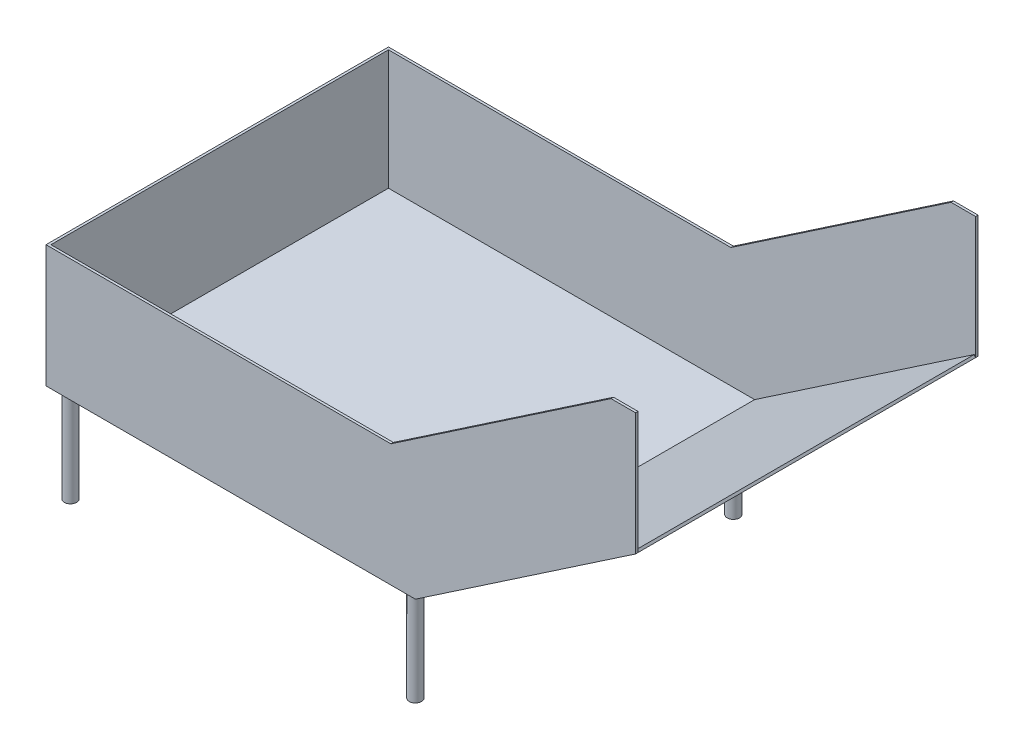
ISO-10303-21;
HEADER;
FILE_DESCRIPTION(('STEP AP214'),'2;1');
FILE_NAME('part.step','',(''),(''),'','','');
FILE_SCHEMA(('AUTOMOTIVE_DESIGN { 1 0 10303 214 1 1 1 1 }'));
ENDSEC;
DATA;
#1=APPLICATION_CONTEXT('core data for automotive mechanical design processes');
#2=APPLICATION_PROTOCOL_DEFINITION('international standard','automotive_design',2000,#1);
#3=PRODUCT_CONTEXT('',#1,'mechanical');
#4=PRODUCT('Part','Part','',(#3));
#5=PRODUCT_RELATED_PRODUCT_CATEGORY('part','',(#4));
#6=PRODUCT_DEFINITION_FORMATION('','',#4);
#7=PRODUCT_DEFINITION_CONTEXT('part definition',#1,'design');
#8=PRODUCT_DEFINITION('design','',#6,#7);
#9=PRODUCT_DEFINITION_SHAPE('','',#8);
#10=(LENGTH_UNIT() NAMED_UNIT(*) SI_UNIT(.MILLI.,.METRE.));
#11=(NAMED_UNIT(*) PLANE_ANGLE_UNIT() SI_UNIT($,.RADIAN.));
#12=(NAMED_UNIT(*) SI_UNIT($,.STERADIAN.) SOLID_ANGLE_UNIT());
#13=UNCERTAINTY_MEASURE_WITH_UNIT(LENGTH_MEASURE(1.E-05),#10,'distance_accuracy_value','');
#14=(GEOMETRIC_REPRESENTATION_CONTEXT(3) GLOBAL_UNCERTAINTY_ASSIGNED_CONTEXT((#13)) GLOBAL_UNIT_ASSIGNED_CONTEXT((#10,
#11,#12)) REPRESENTATION_CONTEXT('',''));
#15=CARTESIAN_POINT('',(0.,0.,0.));
#16=DIRECTION('',(0.,0.,1.));
#17=DIRECTION('',(1.,0.,0.));
#18=AXIS2_PLACEMENT_3D('',#15,#16,#17);
#19=CARTESIAN_POINT('',(0.,1.,0.));
#20=DIRECTION('',(0.,-1.,0.));
#21=DIRECTION('',(1.,0.,0.));
#22=AXIS2_PLACEMENT_3D('',#19,#20,#21);
#23=PLANE('',#22);
#24=DIRECTION('',(0.,0.,1.));
#25=VECTOR('',#24,1.);
#26=CARTESIAN_POINT('',(149.693042257714,1.,0.));
#27=LINE('',#26,#25);
#28=CARTESIAN_POINT('',(149.693042257714,1.,-138.));
#29=VERTEX_POINT('',#28);
#30=CARTESIAN_POINT('',(149.693042257714,1.,0.));
#31=VERTEX_POINT('',#30);
#32=EDGE_CURVE('E150',#29,#31,#27,.T.);
#33=ORIENTED_EDGE('',*,*,#32,.F.);
#34=DIRECTION('',(1.,0.,0.));
#35=VECTOR('',#34,1.);
#36=CARTESIAN_POINT('',(0.,1.,-138.));
#37=LINE('',#36,#35);
#38=CARTESIAN_POINT('',(0.,1.,-138.));
#39=VERTEX_POINT('',#38);
#40=EDGE_CURVE('E164',#39,#29,#37,.T.);
#41=ORIENTED_EDGE('',*,*,#40,.F.);
#42=DIRECTION('',(0.,0.,1.));
#43=VECTOR('',#42,1.);
#44=CARTESIAN_POINT('',(0.,1.,0.));
#45=LINE('',#44,#43);
#46=CARTESIAN_POINT('',(0.,1.,0.));
#47=VERTEX_POINT('',#46);
#48=EDGE_CURVE('E151',#39,#47,#45,.T.);
#49=ORIENTED_EDGE('',*,*,#48,.T.);
#50=DIRECTION('',(-1.,0.,0.));
#51=VECTOR('',#50,1.);
#52=CARTESIAN_POINT('',(0.,1.,0.));
#53=LINE('',#52,#51);
#54=EDGE_CURVE('E147',#31,#47,#53,.T.);
#55=ORIENTED_EDGE('',*,*,#54,.F.);
#56=EDGE_LOOP('',(#33,#41,#49,#55));
#57=FACE_BOUND('',#56,.T.);
#58=ADVANCED_FACE('F38',(#57),#23,.F.);
#59=CARTESIAN_POINT('',(0.,0.,0.));
#60=DIRECTION('',(-1.,0.,0.));
#61=DIRECTION('',(0.,0.,1.));
#62=AXIS2_PLACEMENT_3D('',#59,#60,#61);
#63=PLANE('',#62);
#64=ORIENTED_EDGE('',*,*,#48,.F.);
#65=DIRECTION('',(0.,-1.,0.));
#66=VECTOR('',#65,1.);
#67=CARTESIAN_POINT('',(0.,0.,-138.));
#68=LINE('',#67,#66);
#69=CARTESIAN_POINT('',(0.,50.,-138.));
#70=VERTEX_POINT('',#69);
#71=EDGE_CURVE('E154',#70,#39,#68,.T.);
#72=ORIENTED_EDGE('',*,*,#71,.F.);
#73=DIRECTION('',(0.,0.,-1.));
#74=VECTOR('',#73,1.);
#75=CARTESIAN_POINT('',(0.,50.,1.));
#76=LINE('',#75,#74);
#77=CARTESIAN_POINT('',(0.,50.,0.));
#78=VERTEX_POINT('',#77);
#79=EDGE_CURVE('E238',#78,#70,#76,.T.);
#80=ORIENTED_EDGE('',*,*,#79,.F.);
#81=DIRECTION('',(0.,-1.,0.));
#82=VECTOR('',#81,1.);
#83=CARTESIAN_POINT('',(0.,0.,0.));
#84=LINE('',#83,#82);
#85=EDGE_CURVE('E254',#78,#47,#84,.T.);
#86=ORIENTED_EDGE('',*,*,#85,.T.);
#87=EDGE_LOOP('',(#64,#72,#80,#86));
#88=FACE_BOUND('',#87,.T.);
#89=ADVANCED_FACE('F184',(#88),#63,.F.);
#90=CARTESIAN_POINT('',(150.,0.,1.));
#91=DIRECTION('',(0.,1.,0.));
#92=DIRECTION('',(-1.,0.,0.));
#93=AXIS2_PLACEMENT_3D('',#90,#91,#92);
#94=PLANE('',#93);
#95=CARTESIAN_POINT('',(145.,0.,-134.));
#96=DIRECTION('',(0.,1.,0.));
#97=DIRECTION('',(-1.,0.,0.));
#98=AXIS2_PLACEMENT_3D('',#95,#96,#97);
#99=CIRCLE('',#98,2.5);
#100=CARTESIAN_POINT('',(142.5,0.,-134.));
#101=VERTEX_POINT('',#100);
#102=EDGE_CURVE('E11',#101,#101,#99,.F.);
#103=ORIENTED_EDGE('',*,*,#102,.F.);
#104=EDGE_LOOP('',(#103));
#105=FACE_BOUND('',#104,.T.);
#106=CARTESIAN_POINT('',(145.,0.,-4.));
#107=DIRECTION('',(0.,1.,0.));
#108=DIRECTION('',(-1.,0.,0.));
#109=AXIS2_PLACEMENT_3D('',#106,#107,#108);
#110=CIRCLE('',#109,2.5);
#111=CARTESIAN_POINT('',(142.5,0.,-4.));
#112=VERTEX_POINT('',#111);
#113=EDGE_CURVE('E46',#112,#112,#110,.F.);
#114=ORIENTED_EDGE('',*,*,#113,.F.);
#115=EDGE_LOOP('',(#114));
#116=FACE_BOUND('',#115,.T.);
#117=CARTESIAN_POINT('',(4.,0.,-134.));
#118=DIRECTION('',(0.,1.,0.));
#119=DIRECTION('',(-1.,0.,0.));
#120=AXIS2_PLACEMENT_3D('',#117,#118,#119);
#121=CIRCLE('',#120,2.5);
#122=CARTESIAN_POINT('',(1.5,0.,-134.));
#123=VERTEX_POINT('',#122);
#124=EDGE_CURVE('E174',#123,#123,#121,.F.);
#125=ORIENTED_EDGE('',*,*,#124,.F.);
#126=EDGE_LOOP('',(#125));
#127=FACE_BOUND('',#126,.T.);
#128=CARTESIAN_POINT('',(4.,0.,-4.));
#129=DIRECTION('',(0.,1.,0.));
#130=DIRECTION('',(-1.,0.,0.));
#131=AXIS2_PLACEMENT_3D('',#128,#129,#130);
#132=CIRCLE('',#131,2.5);
#133=CARTESIAN_POINT('',(1.5,0.,-4.));
#134=VERTEX_POINT('',#133);
#135=EDGE_CURVE('E166',#134,#134,#132,.F.);
#136=ORIENTED_EDGE('',*,*,#135,.F.);
#137=EDGE_LOOP('',(#136));
#138=FACE_BOUND('',#137,.T.);
#139=DIRECTION('',(1.,0.,0.));
#140=VECTOR('',#139,1.);
#141=CARTESIAN_POINT('',(-1.,0.,-139.));
#142=LINE('',#141,#140);
#143=CARTESIAN_POINT('',(-1.,0.,-139.));
#144=VERTEX_POINT('',#143);
#145=CARTESIAN_POINT('',(150.,0.,-139.));
#146=VERTEX_POINT('',#145);
#147=EDGE_CURVE('E194',#144,#146,#142,.T.);
#148=ORIENTED_EDGE('',*,*,#147,.T.);
#149=DIRECTION('',(0.,0.,-1.));
#150=VECTOR('',#149,1.);
#151=CARTESIAN_POINT('',(150.,0.,1.));
#152=LINE('',#151,#150);
#153=CARTESIAN_POINT('',(150.,0.,1.));
#154=VERTEX_POINT('',#153);
#155=EDGE_CURVE('E168',#154,#146,#152,.T.);
#156=ORIENTED_EDGE('',*,*,#155,.F.);
#157=DIRECTION('',(1.,0.,0.));
#158=VECTOR('',#157,1.);
#159=CARTESIAN_POINT('',(150.,0.,1.));
#160=LINE('',#159,#158);
#161=CARTESIAN_POINT('',(-1.,0.,1.));
#162=VERTEX_POINT('',#161);
#163=EDGE_CURVE('E250',#162,#154,#160,.T.);
#164=ORIENTED_EDGE('',*,*,#163,.F.);
#165=DIRECTION('',(0.,0.,1.));
#166=VECTOR('',#165,1.);
#167=CARTESIAN_POINT('',(-1.,0.,1.));
#168=LINE('',#167,#166);
#169=EDGE_CURVE('E197',#144,#162,#168,.T.);
#170=ORIENTED_EDGE('',*,*,#169,.F.);
#171=EDGE_LOOP('',(#148,#156,#164,#170));
#172=FACE_BOUND('',#171,.T.);
#173=ADVANCED_FACE('F40',(#105,#116,#127,#138,#172),#94,.F.);
#174=CARTESIAN_POINT('',(240.,61.,1.));
#175=DIRECTION('',(-0.561051498100533,0.827780898836852,0.));
#176=DIRECTION('',(-0.827780898836852,-0.561051498100533,0.));
#177=AXIS2_PLACEMENT_3D('',#174,#175,#176);
#178=PLANE('',#177);
#179=ORIENTED_EDGE('',*,*,#155,.T.);
#180=DIRECTION('',(0.827780898836852,0.561051498100533,0.));
#181=VECTOR('',#180,1.);
#182=CARTESIAN_POINT('',(240.,61.,-139.));
#183=LINE('',#182,#181);
#184=CARTESIAN_POINT('',(240.,61.,-139.));
#185=VERTEX_POINT('',#184);
#186=EDGE_CURVE('E204',#146,#185,#183,.T.);
#187=ORIENTED_EDGE('',*,*,#186,.T.);
#188=DIRECTION('',(0.,0.,1.));
#189=VECTOR('',#188,1.);
#190=CARTESIAN_POINT('',(240.,61.,-139.));
#191=LINE('',#190,#189);
#192=CARTESIAN_POINT('',(240.,61.,-138.));
#193=VERTEX_POINT('',#192);
#194=EDGE_CURVE('E211',#185,#193,#191,.T.);
#195=ORIENTED_EDGE('',*,*,#194,.T.);
#196=DIRECTION('',(0.,0.,1.));
#197=VECTOR('',#196,1.);
#198=CARTESIAN_POINT('',(240.,61.,-139.));
#199=LINE('',#198,#197);
#200=CARTESIAN_POINT('',(240.,61.,0.));
#201=VERTEX_POINT('',#200);
#202=EDGE_CURVE('E309',#193,#201,#199,.T.);
#203=ORIENTED_EDGE('',*,*,#202,.T.);
#204=DIRECTION('',(0.,0.,-1.));
#205=VECTOR('',#204,1.);
#206=CARTESIAN_POINT('',(240.,61.,1.));
#207=LINE('',#206,#205);
#208=CARTESIAN_POINT('',(240.,61.,1.));
#209=VERTEX_POINT('',#208);
#210=EDGE_CURVE('E282',#209,#201,#207,.T.);
#211=ORIENTED_EDGE('',*,*,#210,.F.);
#212=DIRECTION('',(0.827780898836852,0.561051498100533,0.));
#213=VECTOR('',#212,1.);
#214=CARTESIAN_POINT('',(240.,61.,1.));
#215=LINE('',#214,#213);
#216=EDGE_CURVE('E253',#154,#209,#215,.T.);
#217=ORIENTED_EDGE('',*,*,#216,.F.);
#218=EDGE_LOOP('',(#179,#187,#195,#203,#211,#217));
#219=FACE_BOUND('',#218,.T.);
#220=ADVANCED_FACE('F183',(#219),#178,.F.);
#221=CARTESIAN_POINT('',(240.,111.,1.));
#222=DIRECTION('',(-1.,0.,0.));
#223=DIRECTION('',(0.,-1.,0.));
#224=AXIS2_PLACEMENT_3D('',#221,#222,#223);
#225=PLANE('',#224);
#226=DIRECTION('',(0.,1.,0.));
#227=VECTOR('',#226,1.);
#228=CARTESIAN_POINT('',(240.,111.,0.));
#229=LINE('',#228,#227);
#230=CARTESIAN_POINT('',(240.,111.,0.));
#231=VERTEX_POINT('',#230);
#232=EDGE_CURVE('E249',#201,#231,#229,.T.);
#233=ORIENTED_EDGE('',*,*,#232,.T.);
#234=DIRECTION('',(0.,0.,-1.));
#235=VECTOR('',#234,1.);
#236=CARTESIAN_POINT('',(240.,111.,1.));
#237=LINE('',#236,#235);
#238=CARTESIAN_POINT('',(240.,111.,1.));
#239=VERTEX_POINT('',#238);
#240=EDGE_CURVE('E279',#239,#231,#237,.T.);
#241=ORIENTED_EDGE('',*,*,#240,.F.);
#242=DIRECTION('',(0.,1.,0.));
#243=VECTOR('',#242,1.);
#244=CARTESIAN_POINT('',(240.,111.,1.));
#245=LINE('',#244,#243);
#246=EDGE_CURVE('E256',#209,#239,#245,.T.);
#247=ORIENTED_EDGE('',*,*,#246,.F.);
#248=ORIENTED_EDGE('',*,*,#210,.T.);
#249=EDGE_LOOP('',(#233,#241,#247,#248));
#250=FACE_BOUND('',#249,.T.);
#251=ADVANCED_FACE('F381',(#250),#225,.F.);
#252=CARTESIAN_POINT('',(230.,111.,1.));
#253=DIRECTION('',(0.,-1.,0.));
#254=DIRECTION('',(0.,0.,-1.));
#255=AXIS2_PLACEMENT_3D('',#252,#253,#254);
#256=PLANE('',#255);
#257=DIRECTION('',(-1.,0.,0.));
#258=VECTOR('',#257,1.);
#259=CARTESIAN_POINT('',(230.,111.,0.));
#260=LINE('',#259,#258);
#261=CARTESIAN_POINT('',(230.,111.,0.));
#262=VERTEX_POINT('',#261);
#263=EDGE_CURVE('E267',#231,#262,#260,.T.);
#264=ORIENTED_EDGE('',*,*,#263,.T.);
#265=DIRECTION('',(0.,0.,-1.));
#266=VECTOR('',#265,1.);
#267=CARTESIAN_POINT('',(230.,111.,1.));
#268=LINE('',#267,#266);
#269=CARTESIAN_POINT('',(230.,111.,1.));
#270=VERTEX_POINT('',#269);
#271=EDGE_CURVE('E276',#270,#262,#268,.T.);
#272=ORIENTED_EDGE('',*,*,#271,.F.);
#273=DIRECTION('',(-1.,0.,0.));
#274=VECTOR('',#273,1.);
#275=CARTESIAN_POINT('',(230.,111.,1.));
#276=LINE('',#275,#274);
#277=EDGE_CURVE('E258',#239,#270,#276,.T.);
#278=ORIENTED_EDGE('',*,*,#277,.F.);
#279=ORIENTED_EDGE('',*,*,#240,.T.);
#280=EDGE_LOOP('',(#264,#272,#278,#279));
#281=FACE_BOUND('',#280,.T.);
#282=ADVANCED_FACE('F377',(#281),#256,.F.);
#283=CARTESIAN_POINT('',(140.,50.,1.));
#284=DIRECTION('',(0.561051498100534,-0.827780898836852,0.));
#285=DIRECTION('',(0.827780898836852,0.561051498100534,0.));
#286=AXIS2_PLACEMENT_3D('',#283,#284,#285);
#287=PLANE('',#286);
#288=DIRECTION('',(-0.827780898836852,-0.561051498100534,0.));
#289=VECTOR('',#288,1.);
#290=CARTESIAN_POINT('',(140.,50.,0.));
#291=LINE('',#290,#289);
#292=CARTESIAN_POINT('',(140.,50.,0.));
#293=VERTEX_POINT('',#292);
#294=EDGE_CURVE('E269',#262,#293,#291,.T.);
#295=ORIENTED_EDGE('',*,*,#294,.T.);
#296=DIRECTION('',(0.,0.,-1.));
#297=VECTOR('',#296,1.);
#298=CARTESIAN_POINT('',(140.,50.,1.));
#299=LINE('',#298,#297);
#300=CARTESIAN_POINT('',(140.,50.,1.));
#301=VERTEX_POINT('',#300);
#302=EDGE_CURVE('E265',#301,#293,#299,.T.);
#303=ORIENTED_EDGE('',*,*,#302,.F.);
#304=DIRECTION('',(-0.827780898836852,-0.561051498100534,0.));
#305=VECTOR('',#304,1.);
#306=CARTESIAN_POINT('',(140.,50.,1.));
#307=LINE('',#306,#305);
#308=EDGE_CURVE('E260',#270,#301,#307,.T.);
#309=ORIENTED_EDGE('',*,*,#308,.F.);
#310=ORIENTED_EDGE('',*,*,#271,.T.);
#311=EDGE_LOOP('',(#295,#303,#309,#310));
#312=FACE_BOUND('',#311,.T.);
#313=ADVANCED_FACE('F374',(#312),#287,.F.);
#314=CARTESIAN_POINT('',(0.,50.,1.));
#315=DIRECTION('',(0.,-1.,0.));
#316=DIRECTION('',(0.,0.,-1.));
#317=AXIS2_PLACEMENT_3D('',#314,#315,#316);
#318=PLANE('',#317);
#319=DIRECTION('',(-1.,0.,0.));
#320=VECTOR('',#319,1.);
#321=CARTESIAN_POINT('',(0.,50.,0.));
#322=LINE('',#321,#320);
#323=EDGE_CURVE('E271',#293,#78,#322,.T.);
#324=ORIENTED_EDGE('',*,*,#323,.T.);
#325=ORIENTED_EDGE('',*,*,#79,.T.);
#326=DIRECTION('',(-1.,0.,0.));
#327=VECTOR('',#326,1.);
#328=CARTESIAN_POINT('',(0.,50.,-138.));
#329=LINE('',#328,#327);
#330=CARTESIAN_POINT('',(140.,50.,-138.));
#331=VERTEX_POINT('',#330);
#332=EDGE_CURVE('E221',#331,#70,#329,.T.);
#333=ORIENTED_EDGE('',*,*,#332,.F.);
#334=DIRECTION('',(0.,0.,1.));
#335=VECTOR('',#334,1.);
#336=CARTESIAN_POINT('',(140.,50.,-139.));
#337=LINE('',#336,#335);
#338=CARTESIAN_POINT('',(140.,50.,-139.));
#339=VERTEX_POINT('',#338);
#340=EDGE_CURVE('E236',#339,#331,#337,.T.);
#341=ORIENTED_EDGE('',*,*,#340,.F.);
#342=DIRECTION('',(1.,0.,0.));
#343=VECTOR('',#342,1.);
#344=CARTESIAN_POINT('',(-1.,50.,-139.));
#345=LINE('',#344,#343);
#346=CARTESIAN_POINT('',(-1.,50.,-139.));
#347=VERTEX_POINT('',#346);
#348=EDGE_CURVE('E200',#347,#339,#345,.T.);
#349=ORIENTED_EDGE('',*,*,#348,.F.);
#350=DIRECTION('',(0.,0.,-1.));
#351=VECTOR('',#350,1.);
#352=CARTESIAN_POINT('',(-1.,50.,1.));
#353=LINE('',#352,#351);
#354=CARTESIAN_POINT('',(-1.,50.,1.));
#355=VERTEX_POINT('',#354);
#356=EDGE_CURVE('E241',#355,#347,#353,.T.);
#357=ORIENTED_EDGE('',*,*,#356,.F.);
#358=DIRECTION('',(-1.,0.,0.));
#359=VECTOR('',#358,1.);
#360=CARTESIAN_POINT('',(0.,50.,1.));
#361=LINE('',#360,#359);
#362=EDGE_CURVE('E262',#301,#355,#361,.T.);
#363=ORIENTED_EDGE('',*,*,#362,.F.);
#364=ORIENTED_EDGE('',*,*,#302,.T.);
#365=EDGE_LOOP('',(#324,#325,#333,#341,#349,#357,#363,#364));
#366=FACE_BOUND('',#365,.T.);
#367=ADVANCED_FACE('F299',(#366),#318,.F.);
#368=CARTESIAN_POINT('',(0.,0.,1.));
#369=DIRECTION('',(0.,0.,-1.));
#370=DIRECTION('',(-1.,0.,0.));
#371=AXIS2_PLACEMENT_3D('',#368,#369,#370);
#372=PLANE('',#371);
#373=ORIENTED_EDGE('',*,*,#216,.T.);
#374=ORIENTED_EDGE('',*,*,#246,.T.);
#375=ORIENTED_EDGE('',*,*,#277,.T.);
#376=ORIENTED_EDGE('',*,*,#308,.T.);
#377=ORIENTED_EDGE('',*,*,#362,.T.);
#378=DIRECTION('',(0.,1.,0.));
#379=VECTOR('',#378,1.);
#380=CARTESIAN_POINT('',(-1.,0.,1.));
#381=LINE('',#380,#379);
#382=EDGE_CURVE('E239',#162,#355,#381,.T.);
#383=ORIENTED_EDGE('',*,*,#382,.F.);
#384=ORIENTED_EDGE('',*,*,#163,.T.);
#385=EDGE_LOOP('',(#373,#374,#375,#376,#377,#383,#384));
#386=FACE_BOUND('',#385,.T.);
#387=ADVANCED_FACE('F288',(#386),#372,.F.);
#388=CARTESIAN_POINT('',(0.,0.,0.));
#389=DIRECTION('',(0.,0.,-1.));
#390=DIRECTION('',(-1.,0.,0.));
#391=AXIS2_PLACEMENT_3D('',#388,#389,#390);
#392=PLANE('',#391);
#393=DIRECTION('',(0.561051498100533,-0.827780898836852,0.));
#394=VECTOR('',#393,1.);
#395=CARTESIAN_POINT('',(192.783182471872,130.664157008713,0.));
#396=LINE('',#395,#394);
#397=CARTESIAN_POINT('',(239.438948501899,61.8277808988369,0.));
#398=VERTEX_POINT('',#397);
#399=EDGE_CURVE('E53',#398,#201,#396,.T.);
#400=ORIENTED_EDGE('',*,*,#399,.F.);
#401=DIRECTION('',(-0.827780898836852,-0.561051498100534,0.));
#402=VECTOR('',#401,1.);
#403=CARTESIAN_POINT('',(46.6557660300274,-68.8363761098765,0.));
#404=LINE('',#403,#402);
#405=EDGE_CURVE('E156',#398,#31,#404,.T.);
#406=ORIENTED_EDGE('',*,*,#405,.T.);
#407=ORIENTED_EDGE('',*,*,#54,.T.);
#408=ORIENTED_EDGE('',*,*,#85,.F.);
#409=ORIENTED_EDGE('',*,*,#323,.F.);
#410=ORIENTED_EDGE('',*,*,#294,.F.);
#411=ORIENTED_EDGE('',*,*,#263,.F.);
#412=ORIENTED_EDGE('',*,*,#232,.F.);
#413=EDGE_LOOP('',(#400,#406,#407,#408,#409,#410,#411,#412));
#414=FACE_BOUND('',#413,.T.);
#415=ADVANCED_FACE('F157',(#414),#392,.T.);
#416=CARTESIAN_POINT('',(-1.,0.,-139.));
#417=DIRECTION('',(0.,0.,1.));
#418=DIRECTION('',(1.,0.,0.));
#419=AXIS2_PLACEMENT_3D('',#416,#417,#418);
#420=PLANE('',#419);
#421=ORIENTED_EDGE('',*,*,#186,.F.);
#422=ORIENTED_EDGE('',*,*,#147,.F.);
#423=DIRECTION('',(0.,-1.,0.));
#424=VECTOR('',#423,1.);
#425=CARTESIAN_POINT('',(-1.,0.,-139.));
#426=LINE('',#425,#424);
#427=EDGE_CURVE('E243',#347,#144,#426,.T.);
#428=ORIENTED_EDGE('',*,*,#427,.F.);
#429=ORIENTED_EDGE('',*,*,#348,.T.);
#430=DIRECTION('',(-0.827780898836852,-0.561051498100534,0.));
#431=VECTOR('',#430,1.);
#432=CARTESIAN_POINT('',(140.,50.,-139.));
#433=LINE('',#432,#431);
#434=CARTESIAN_POINT('',(230.,111.,-139.));
#435=VERTEX_POINT('',#434);
#436=EDGE_CURVE('E231',#435,#339,#433,.T.);
#437=ORIENTED_EDGE('',*,*,#436,.F.);
#438=DIRECTION('',(-1.,0.,0.));
#439=VECTOR('',#438,1.);
#440=CARTESIAN_POINT('',(230.,111.,-139.));
#441=LINE('',#440,#439);
#442=CARTESIAN_POINT('',(240.,111.,-139.));
#443=VERTEX_POINT('',#442);
#444=EDGE_CURVE('E215',#443,#435,#441,.T.);
#445=ORIENTED_EDGE('',*,*,#444,.F.);
#446=DIRECTION('',(0.,1.,0.));
#447=VECTOR('',#446,1.);
#448=CARTESIAN_POINT('',(240.,111.,-139.));
#449=LINE('',#448,#447);
#450=EDGE_CURVE('E208',#185,#443,#449,.T.);
#451=ORIENTED_EDGE('',*,*,#450,.F.);
#452=EDGE_LOOP('',(#421,#422,#428,#429,#437,#445,#451));
#453=FACE_BOUND('',#452,.T.);
#454=ADVANCED_FACE('F205',(#453),#420,.F.);
#455=CARTESIAN_POINT('',(-1.,0.,0.));
#456=DIRECTION('',(-1.,0.,0.));
#457=DIRECTION('',(0.,0.,1.));
#458=AXIS2_PLACEMENT_3D('',#455,#456,#457);
#459=PLANE('',#458);
#460=ORIENTED_EDGE('',*,*,#382,.T.);
#461=ORIENTED_EDGE('',*,*,#356,.T.);
#462=ORIENTED_EDGE('',*,*,#427,.T.);
#463=ORIENTED_EDGE('',*,*,#169,.T.);
#464=EDGE_LOOP('',(#460,#461,#462,#463));
#465=FACE_BOUND('',#464,.T.);
#466=ADVANCED_FACE('F290',(#465),#459,.T.);
#467=CARTESIAN_POINT('',(140.,50.,-139.));
#468=DIRECTION('',(-0.561051498100534,0.827780898836852,0.));
#469=DIRECTION('',(-0.827780898836852,-0.561051498100534,0.));
#470=AXIS2_PLACEMENT_3D('',#467,#468,#469);
#471=PLANE('',#470);
#472=DIRECTION('',(-0.827780898836852,-0.561051498100534,0.));
#473=VECTOR('',#472,1.);
#474=CARTESIAN_POINT('',(140.,50.,-138.));
#475=LINE('',#474,#473);
#476=CARTESIAN_POINT('',(230.,111.,-138.));
#477=VERTEX_POINT('',#476);
#478=EDGE_CURVE('E223',#477,#331,#475,.T.);
#479=ORIENTED_EDGE('',*,*,#478,.F.);
#480=DIRECTION('',(0.,0.,1.));
#481=VECTOR('',#480,1.);
#482=CARTESIAN_POINT('',(230.,111.,-139.));
#483=LINE('',#482,#481);
#484=EDGE_CURVE('E234',#435,#477,#483,.T.);
#485=ORIENTED_EDGE('',*,*,#484,.F.);
#486=ORIENTED_EDGE('',*,*,#436,.T.);
#487=ORIENTED_EDGE('',*,*,#340,.T.);
#488=EDGE_LOOP('',(#479,#485,#486,#487));
#489=FACE_BOUND('',#488,.T.);
#490=ADVANCED_FACE('F302',(#489),#471,.T.);
#491=CARTESIAN_POINT('',(230.,111.,-139.));
#492=DIRECTION('',(0.,1.,0.));
#493=DIRECTION('',(0.,0.,1.));
#494=AXIS2_PLACEMENT_3D('',#491,#492,#493);
#495=PLANE('',#494);
#496=DIRECTION('',(-1.,0.,0.));
#497=VECTOR('',#496,1.);
#498=CARTESIAN_POINT('',(230.,111.,-138.));
#499=LINE('',#498,#497);
#500=CARTESIAN_POINT('',(240.,111.,-138.));
#501=VERTEX_POINT('',#500);
#502=EDGE_CURVE('E226',#501,#477,#499,.T.);
#503=ORIENTED_EDGE('',*,*,#502,.F.);
#504=DIRECTION('',(0.,0.,1.));
#505=VECTOR('',#504,1.);
#506=CARTESIAN_POINT('',(240.,111.,-139.));
#507=LINE('',#506,#505);
#508=EDGE_CURVE('E213',#443,#501,#507,.T.);
#509=ORIENTED_EDGE('',*,*,#508,.F.);
#510=ORIENTED_EDGE('',*,*,#444,.T.);
#511=ORIENTED_EDGE('',*,*,#484,.T.);
#512=EDGE_LOOP('',(#503,#509,#510,#511));
#513=FACE_BOUND('',#512,.T.);
#514=ADVANCED_FACE('F357',(#513),#495,.T.);
#515=CARTESIAN_POINT('',(240.,111.,-139.));
#516=DIRECTION('',(1.,0.,0.));
#517=DIRECTION('',(0.,1.,0.));
#518=AXIS2_PLACEMENT_3D('',#515,#516,#517);
#519=PLANE('',#518);
#520=DIRECTION('',(0.,1.,0.));
#521=VECTOR('',#520,1.);
#522=CARTESIAN_POINT('',(240.,111.,-138.));
#523=LINE('',#522,#521);
#524=EDGE_CURVE('E229',#193,#501,#523,.T.);
#525=ORIENTED_EDGE('',*,*,#524,.F.);
#526=ORIENTED_EDGE('',*,*,#194,.F.);
#527=ORIENTED_EDGE('',*,*,#450,.T.);
#528=ORIENTED_EDGE('',*,*,#508,.T.);
#529=EDGE_LOOP('',(#525,#526,#527,#528));
#530=FACE_BOUND('',#529,.T.);
#531=ADVANCED_FACE('F354',(#530),#519,.T.);
#532=CARTESIAN_POINT('',(0.,0.,-138.));
#533=DIRECTION('',(0.,0.,1.));
#534=DIRECTION('',(-1.,0.,0.));
#535=AXIS2_PLACEMENT_3D('',#532,#533,#534);
#536=PLANE('',#535);
#537=DIRECTION('',(-0.561051498100533,0.827780898836852,0.));
#538=VECTOR('',#537,1.);
#539=CARTESIAN_POINT('',(192.783182471872,130.664157008713,-138.));
#540=LINE('',#539,#538);
#541=CARTESIAN_POINT('',(239.438948501899,61.8277808988369,-138.));
#542=VERTEX_POINT('',#541);
#543=EDGE_CURVE('E163',#193,#542,#540,.T.);
#544=ORIENTED_EDGE('',*,*,#543,.F.);
#545=ORIENTED_EDGE('',*,*,#524,.T.);
#546=ORIENTED_EDGE('',*,*,#502,.T.);
#547=ORIENTED_EDGE('',*,*,#478,.T.);
#548=ORIENTED_EDGE('',*,*,#332,.T.);
#549=ORIENTED_EDGE('',*,*,#71,.T.);
#550=ORIENTED_EDGE('',*,*,#40,.T.);
#551=DIRECTION('',(0.827780898836852,0.561051498100534,0.));
#552=VECTOR('',#551,1.);
#553=CARTESIAN_POINT('',(46.6557660300274,-68.8363761098765,-138.));
#554=LINE('',#553,#552);
#555=EDGE_CURVE('E61',#29,#542,#554,.T.);
#556=ORIENTED_EDGE('',*,*,#555,.T.);
#557=EDGE_LOOP('',(#544,#545,#546,#547,#548,#549,#550,#556));
#558=FACE_BOUND('',#557,.T.);
#559=ADVANCED_FACE('F351',(#558),#536,.T.);
#560=CARTESIAN_POINT('',(239.438948501899,61.8277808988369,-139.));
#561=DIRECTION('',(0.827780898836852,0.561051498100533,0.));
#562=DIRECTION('',(-0.561051498100533,0.827780898836852,0.));
#563=AXIS2_PLACEMENT_3D('',#560,#561,#562);
#564=PLANE('',#563);
#565=DIRECTION('',(0.,0.,1.));
#566=VECTOR('',#565,1.);
#567=CARTESIAN_POINT('',(239.438948501899,61.8277808988369,-139.));
#568=LINE('',#567,#566);
#569=EDGE_CURVE('E308',#542,#398,#568,.T.);
#570=ORIENTED_EDGE('',*,*,#569,.T.);
#571=ORIENTED_EDGE('',*,*,#399,.T.);
#572=ORIENTED_EDGE('',*,*,#202,.F.);
#573=ORIENTED_EDGE('',*,*,#543,.T.);
#574=EDGE_LOOP('',(#570,#571,#572,#573));
#575=FACE_BOUND('',#574,.T.);
#576=ADVANCED_FACE('F349',(#575),#564,.T.);
#577=CARTESIAN_POINT('',(46.6557660300274,-68.8363761098765,0.));
#578=DIRECTION('',(0.561051498100534,-0.827780898836852,0.));
#579=DIRECTION('',(0.827780898836852,0.561051498100534,0.));
#580=AXIS2_PLACEMENT_3D('',#577,#578,#579);
#581=PLANE('',#580);
#582=ORIENTED_EDGE('',*,*,#405,.F.);
#583=ORIENTED_EDGE('',*,*,#569,.F.);
#584=ORIENTED_EDGE('',*,*,#555,.F.);
#585=ORIENTED_EDGE('',*,*,#32,.T.);
#586=EDGE_LOOP('',(#582,#583,#584,#585));
#587=FACE_BOUND('',#586,.T.);
#588=ADVANCED_FACE('F162',(#587),#581,.F.);
#589=CARTESIAN_POINT('',(4.,-40.,-4.));
#590=DIRECTION('',(0.,1.,0.));
#591=DIRECTION('',(-1.,0.,0.));
#592=AXIS2_PLACEMENT_3D('',#589,#590,#591);
#593=CYLINDRICAL_SURFACE('',#592,2.5);
#594=CARTESIAN_POINT('',(4.,-40.,-4.));
#595=DIRECTION('',(0.,-1.,0.));
#596=DIRECTION('',(1.,0.,0.));
#597=AXIS2_PLACEMENT_3D('',#594,#595,#596);
#598=CIRCLE('',#597,2.5);
#599=CARTESIAN_POINT('',(6.5,-40.,-4.));
#600=VERTEX_POINT('',#599);
#601=EDGE_CURVE('E311',#600,#600,#598,.T.);
#602=ORIENTED_EDGE('',*,*,#601,.F.);
#603=EDGE_LOOP('',(#602));
#604=FACE_BOUND('',#603,.T.);
#605=ORIENTED_EDGE('',*,*,#135,.T.);
#606=EDGE_LOOP('',(#605));
#607=FACE_BOUND('',#606,.T.);
#608=ADVANCED_FACE('F453',(#604,#607),#593,.T.);
#609=CARTESIAN_POINT('',(4.,-40.,-4.));
#610=DIRECTION('',(0.,-1.,0.));
#611=DIRECTION('',(1.,0.,0.));
#612=AXIS2_PLACEMENT_3D('',#609,#610,#611);
#613=PLANE('',#612);
#614=ORIENTED_EDGE('',*,*,#601,.T.);
#615=EDGE_LOOP('',(#614));
#616=FACE_BOUND('',#615,.T.);
#617=ADVANCED_FACE('F459',(#616),#613,.T.);
#618=CARTESIAN_POINT('',(4.,-40.,-134.));
#619=DIRECTION('',(0.,1.,0.));
#620=DIRECTION('',(-1.,0.,0.));
#621=AXIS2_PLACEMENT_3D('',#618,#619,#620);
#622=CYLINDRICAL_SURFACE('',#621,2.5);
#623=CARTESIAN_POINT('',(4.,-40.,-134.));
#624=DIRECTION('',(0.,-1.,0.));
#625=DIRECTION('',(1.,0.,0.));
#626=AXIS2_PLACEMENT_3D('',#623,#624,#625);
#627=CIRCLE('',#626,2.5);
#628=CARTESIAN_POINT('',(6.5,-40.,-134.));
#629=VERTEX_POINT('',#628);
#630=EDGE_CURVE('E315',#629,#629,#627,.T.);
#631=ORIENTED_EDGE('',*,*,#630,.F.);
#632=EDGE_LOOP('',(#631));
#633=FACE_BOUND('',#632,.T.);
#634=ORIENTED_EDGE('',*,*,#124,.T.);
#635=EDGE_LOOP('',(#634));
#636=FACE_BOUND('',#635,.T.);
#637=ADVANCED_FACE('F468',(#633,#636),#622,.T.);
#638=CARTESIAN_POINT('',(4.,-40.,-134.));
#639=DIRECTION('',(0.,-1.,0.));
#640=DIRECTION('',(1.,0.,0.));
#641=AXIS2_PLACEMENT_3D('',#638,#639,#640);
#642=PLANE('',#641);
#643=ORIENTED_EDGE('',*,*,#630,.T.);
#644=EDGE_LOOP('',(#643));
#645=FACE_BOUND('',#644,.T.);
#646=ADVANCED_FACE('F476',(#645),#642,.T.);
#647=CARTESIAN_POINT('',(145.,-40.,-4.));
#648=DIRECTION('',(0.,1.,0.));
#649=DIRECTION('',(-1.,0.,0.));
#650=AXIS2_PLACEMENT_3D('',#647,#648,#649);
#651=CYLINDRICAL_SURFACE('',#650,2.5);
#652=CARTESIAN_POINT('',(145.,-40.,-4.));
#653=DIRECTION('',(0.,-1.,0.));
#654=DIRECTION('',(1.,0.,0.));
#655=AXIS2_PLACEMENT_3D('',#652,#653,#654);
#656=CIRCLE('',#655,2.5);
#657=CARTESIAN_POINT('',(147.5,-40.,-4.));
#658=VERTEX_POINT('',#657);
#659=EDGE_CURVE('E318',#658,#658,#656,.T.);
#660=ORIENTED_EDGE('',*,*,#659,.F.);
#661=EDGE_LOOP('',(#660));
#662=FACE_BOUND('',#661,.T.);
#663=ORIENTED_EDGE('',*,*,#113,.T.);
#664=EDGE_LOOP('',(#663));
#665=FACE_BOUND('',#664,.T.);
#666=ADVANCED_FACE('F179',(#662,#665),#651,.T.);
#667=CARTESIAN_POINT('',(145.,-40.,-4.));
#668=DIRECTION('',(0.,-1.,0.));
#669=DIRECTION('',(1.,0.,0.));
#670=AXIS2_PLACEMENT_3D('',#667,#668,#669);
#671=PLANE('',#670);
#672=ORIENTED_EDGE('',*,*,#659,.T.);
#673=EDGE_LOOP('',(#672));
#674=FACE_BOUND('',#673,.T.);
#675=ADVANCED_FACE('F330',(#674),#671,.T.);
#676=CARTESIAN_POINT('',(145.,-40.,-134.));
#677=DIRECTION('',(0.,1.,0.));
#678=DIRECTION('',(-1.,0.,0.));
#679=AXIS2_PLACEMENT_3D('',#676,#677,#678);
#680=CYLINDRICAL_SURFACE('',#679,2.5);
#681=CARTESIAN_POINT('',(145.,-40.,-134.));
#682=DIRECTION('',(0.,-1.,0.));
#683=DIRECTION('',(1.,0.,0.));
#684=AXIS2_PLACEMENT_3D('',#681,#682,#683);
#685=CIRCLE('',#684,2.5);
#686=CARTESIAN_POINT('',(147.5,-40.,-134.));
#687=VERTEX_POINT('',#686);
#688=EDGE_CURVE('E321',#687,#687,#685,.T.);
#689=ORIENTED_EDGE('',*,*,#688,.F.);
#690=EDGE_LOOP('',(#689));
#691=FACE_BOUND('',#690,.T.);
#692=ORIENTED_EDGE('',*,*,#102,.T.);
#693=EDGE_LOOP('',(#692));
#694=FACE_BOUND('',#693,.T.);
#695=ADVANCED_FACE('F327',(#691,#694),#680,.T.);
#696=CARTESIAN_POINT('',(145.,-40.,-134.));
#697=DIRECTION('',(0.,-1.,0.));
#698=DIRECTION('',(1.,0.,0.));
#699=AXIS2_PLACEMENT_3D('',#696,#697,#698);
#700=PLANE('',#699);
#701=ORIENTED_EDGE('',*,*,#688,.T.);
#702=EDGE_LOOP('',(#701));
#703=FACE_BOUND('',#702,.T.);
#704=ADVANCED_FACE('F325',(#703),#700,.T.);
#705=CLOSED_SHELL('',(#58,#89,#173,#220,#251,#282,#313,#367,#387,#415,#454,#466,#490,#514,#531,
#559,#576,#588,#608,#617,#637,#646,#666,#675,#695,#704));
#706=MANIFOLD_SOLID_BREP('B2',#705);
#707=ADVANCED_BREP_SHAPE_REPRESENTATION('',(#18,#706),#14);
#708=SHAPE_DEFINITION_REPRESENTATION(#9,#707);
ENDSEC;
END-ISO-10303-21;
